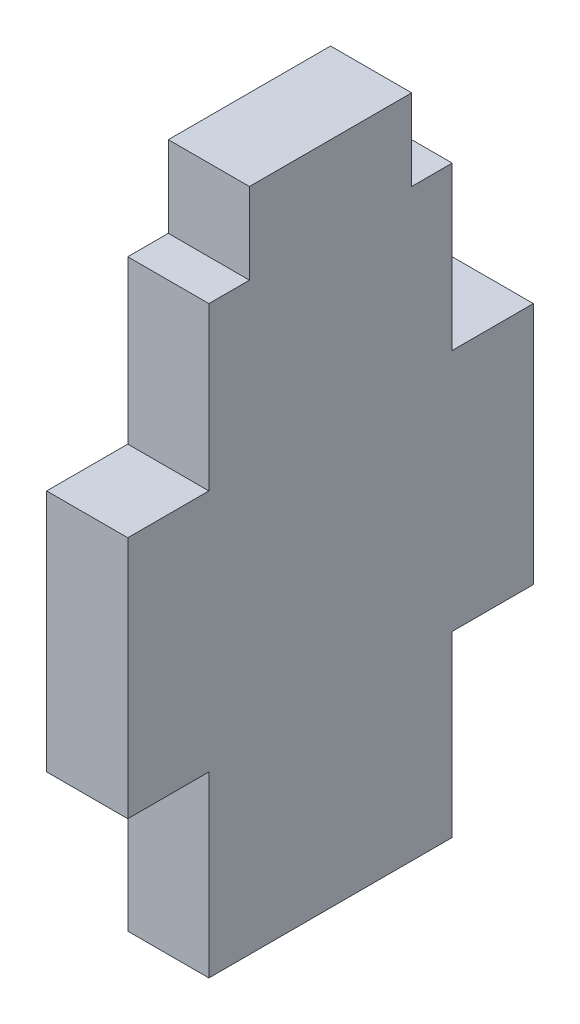
ISO-10303-21;
HEADER;
FILE_DESCRIPTION(('STEP AP214'),'2;1');
FILE_NAME('part.step','',(''),(''),'','','');
FILE_SCHEMA(('AUTOMOTIVE_DESIGN { 1 0 10303 214 1 1 1 1 }'));
ENDSEC;
DATA;
#1=APPLICATION_CONTEXT('core data for automotive mechanical design processes');
#2=APPLICATION_PROTOCOL_DEFINITION('international standard','automotive_design',2000,#1);
#3=PRODUCT_CONTEXT('',#1,'mechanical');
#4=PRODUCT('Part','Part','',(#3));
#5=PRODUCT_RELATED_PRODUCT_CATEGORY('part','',(#4));
#6=PRODUCT_DEFINITION_FORMATION('','',#4);
#7=PRODUCT_DEFINITION_CONTEXT('part definition',#1,'design');
#8=PRODUCT_DEFINITION('design','',#6,#7);
#9=PRODUCT_DEFINITION_SHAPE('','',#8);
#10=(LENGTH_UNIT() NAMED_UNIT(*) SI_UNIT(.MILLI.,.METRE.));
#11=(NAMED_UNIT(*) PLANE_ANGLE_UNIT() SI_UNIT($,.RADIAN.));
#12=(NAMED_UNIT(*) SI_UNIT($,.STERADIAN.) SOLID_ANGLE_UNIT());
#13=UNCERTAINTY_MEASURE_WITH_UNIT(LENGTH_MEASURE(1.E-05),#10,'distance_accuracy_value','');
#14=(GEOMETRIC_REPRESENTATION_CONTEXT(3) GLOBAL_UNCERTAINTY_ASSIGNED_CONTEXT((#13)) GLOBAL_UNIT_ASSIGNED_CONTEXT((#10,
#11,#12)) REPRESENTATION_CONTEXT('',''));
#15=CARTESIAN_POINT('',(0.,0.,0.));
#16=DIRECTION('',(0.,0.,1.));
#17=DIRECTION('',(1.,0.,0.));
#18=AXIS2_PLACEMENT_3D('',#15,#16,#17);
#19=CARTESIAN_POINT('',(5.,0.,0.));
#20=DIRECTION('',(0.,0.,1.));
#21=DIRECTION('',(0.,-1.,0.));
#22=AXIS2_PLACEMENT_3D('',#19,#20,#21);
#23=PLANE('',#22);
#24=DIRECTION('',(0.,1.,0.));
#25=VECTOR('',#24,1.);
#26=CARTESIAN_POINT('',(0.,0.,0.));
#27=LINE('',#26,#25);
#28=CARTESIAN_POINT('',(0.,0.,0.));
#29=VERTEX_POINT('',#28);
#30=CARTESIAN_POINT('',(0.,11.,0.));
#31=VERTEX_POINT('',#30);
#32=EDGE_CURVE('E178',#29,#31,#27,.T.);
#33=ORIENTED_EDGE('',*,*,#32,.T.);
#34=DIRECTION('',(-1.,0.,0.));
#35=VECTOR('',#34,1.);
#36=CARTESIAN_POINT('',(5.,11.,0.));
#37=LINE('',#36,#35);
#38=CARTESIAN_POINT('',(5.,11.,0.));
#39=VERTEX_POINT('',#38);
#40=EDGE_CURVE('E11',#39,#31,#37,.T.);
#41=ORIENTED_EDGE('',*,*,#40,.F.);
#42=DIRECTION('',(0.,1.,0.));
#43=VECTOR('',#42,1.);
#44=CARTESIAN_POINT('',(5.,0.,0.));
#45=LINE('',#44,#43);
#46=CARTESIAN_POINT('',(5.,0.,0.));
#47=VERTEX_POINT('',#46);
#48=EDGE_CURVE('E208',#47,#39,#45,.T.);
#49=ORIENTED_EDGE('',*,*,#48,.F.);
#50=DIRECTION('',(-1.,0.,0.));
#51=VECTOR('',#50,1.);
#52=CARTESIAN_POINT('',(5.,0.,0.));
#53=LINE('',#52,#51);
#54=EDGE_CURVE('E174',#47,#29,#53,.T.);
#55=ORIENTED_EDGE('',*,*,#54,.T.);
#56=EDGE_LOOP('',(#33,#41,#49,#55));
#57=FACE_BOUND('',#56,.T.);
#58=ADVANCED_FACE('F34',(#57),#23,.F.);
#59=CARTESIAN_POINT('',(5.,11.,0.));
#60=DIRECTION('',(0.,1.,0.));
#61=DIRECTION('',(0.,0.,1.));
#62=AXIS2_PLACEMENT_3D('',#59,#60,#61);
#63=PLANE('',#62);
#64=DIRECTION('',(0.,0.,-1.));
#65=VECTOR('',#64,1.);
#66=CARTESIAN_POINT('',(0.,11.,0.));
#67=LINE('',#66,#65);
#68=CARTESIAN_POINT('',(0.,11.,-5.));
#69=VERTEX_POINT('',#68);
#70=EDGE_CURVE('E181',#31,#69,#67,.T.);
#71=ORIENTED_EDGE('',*,*,#70,.T.);
#72=DIRECTION('',(-1.,0.,0.));
#73=VECTOR('',#72,1.);
#74=CARTESIAN_POINT('',(5.,11.,-5.));
#75=LINE('',#74,#73);
#76=CARTESIAN_POINT('',(5.,11.,-5.));
#77=VERTEX_POINT('',#76);
#78=EDGE_CURVE('E42',#77,#69,#75,.T.);
#79=ORIENTED_EDGE('',*,*,#78,.F.);
#80=DIRECTION('',(0.,0.,-1.));
#81=VECTOR('',#80,1.);
#82=CARTESIAN_POINT('',(5.,11.,0.));
#83=LINE('',#82,#81);
#84=EDGE_CURVE('E117',#39,#77,#83,.T.);
#85=ORIENTED_EDGE('',*,*,#84,.F.);
#86=ORIENTED_EDGE('',*,*,#40,.T.);
#87=EDGE_LOOP('',(#71,#79,#85,#86));
#88=FACE_BOUND('',#87,.T.);
#89=ADVANCED_FACE('F306',(#88),#63,.F.);
#90=CARTESIAN_POINT('',(5.,26.,-5.));
#91=DIRECTION('',(0.,0.,1.));
#92=DIRECTION('',(0.,-1.,0.));
#93=AXIS2_PLACEMENT_3D('',#90,#91,#92);
#94=PLANE('',#93);
#95=DIRECTION('',(0.,1.,0.));
#96=VECTOR('',#95,1.);
#97=CARTESIAN_POINT('',(0.,26.,-5.));
#98=LINE('',#97,#96);
#99=CARTESIAN_POINT('',(0.,26.,-5.));
#100=VERTEX_POINT('',#99);
#101=EDGE_CURVE('E183',#69,#100,#98,.T.);
#102=ORIENTED_EDGE('',*,*,#101,.T.);
#103=DIRECTION('',(-1.,0.,0.));
#104=VECTOR('',#103,1.);
#105=CARTESIAN_POINT('',(5.,26.,-5.));
#106=LINE('',#105,#104);
#107=CARTESIAN_POINT('',(5.,26.,-5.));
#108=VERTEX_POINT('',#107);
#109=EDGE_CURVE('E239',#108,#100,#106,.T.);
#110=ORIENTED_EDGE('',*,*,#109,.F.);
#111=DIRECTION('',(0.,1.,0.));
#112=VECTOR('',#111,1.);
#113=CARTESIAN_POINT('',(5.,26.,-5.));
#114=LINE('',#113,#112);
#115=EDGE_CURVE('E247',#77,#108,#114,.T.);
#116=ORIENTED_EDGE('',*,*,#115,.F.);
#117=ORIENTED_EDGE('',*,*,#78,.T.);
#118=EDGE_LOOP('',(#102,#110,#116,#117));
#119=FACE_BOUND('',#118,.T.);
#120=ADVANCED_FACE('F245',(#119),#94,.F.);
#121=CARTESIAN_POINT('',(5.,26.,0.));
#122=DIRECTION('',(0.,-1.,0.));
#123=DIRECTION('',(0.,0.,-1.));
#124=AXIS2_PLACEMENT_3D('',#121,#122,#123);
#125=PLANE('',#124);
#126=DIRECTION('',(0.,0.,1.));
#127=VECTOR('',#126,1.);
#128=CARTESIAN_POINT('',(0.,26.,0.));
#129=LINE('',#128,#127);
#130=CARTESIAN_POINT('',(0.,26.,0.));
#131=VERTEX_POINT('',#130);
#132=EDGE_CURVE('E185',#100,#131,#129,.T.);
#133=ORIENTED_EDGE('',*,*,#132,.T.);
#134=DIRECTION('',(-1.,0.,0.));
#135=VECTOR('',#134,1.);
#136=CARTESIAN_POINT('',(5.,26.,0.));
#137=LINE('',#136,#135);
#138=CARTESIAN_POINT('',(5.,26.,0.));
#139=VERTEX_POINT('',#138);
#140=EDGE_CURVE('E236',#139,#131,#137,.T.);
#141=ORIENTED_EDGE('',*,*,#140,.F.);
#142=DIRECTION('',(0.,0.,1.));
#143=VECTOR('',#142,1.);
#144=CARTESIAN_POINT('',(5.,26.,0.));
#145=LINE('',#144,#143);
#146=EDGE_CURVE('E265',#108,#139,#145,.T.);
#147=ORIENTED_EDGE('',*,*,#146,.F.);
#148=ORIENTED_EDGE('',*,*,#109,.T.);
#149=EDGE_LOOP('',(#133,#141,#147,#148));
#150=FACE_BOUND('',#149,.T.);
#151=ADVANCED_FACE('F256',(#150),#125,.F.);
#152=CARTESIAN_POINT('',(5.,26.,0.));
#153=DIRECTION('',(0.,0.,1.));
#154=DIRECTION('',(0.,-1.,0.));
#155=AXIS2_PLACEMENT_3D('',#152,#153,#154);
#156=PLANE('',#155);
#157=DIRECTION('',(0.,1.,0.));
#158=VECTOR('',#157,1.);
#159=CARTESIAN_POINT('',(0.,26.,0.));
#160=LINE('',#159,#158);
#161=CARTESIAN_POINT('',(0.,36.,0.));
#162=VERTEX_POINT('',#161);
#163=EDGE_CURVE('E187',#131,#162,#160,.T.);
#164=ORIENTED_EDGE('',*,*,#163,.T.);
#165=DIRECTION('',(-1.,0.,0.));
#166=VECTOR('',#165,1.);
#167=CARTESIAN_POINT('',(5.,36.,0.));
#168=LINE('',#167,#166);
#169=CARTESIAN_POINT('',(5.,36.,0.));
#170=VERTEX_POINT('',#169);
#171=EDGE_CURVE('E233',#170,#162,#168,.T.);
#172=ORIENTED_EDGE('',*,*,#171,.F.);
#173=DIRECTION('',(0.,1.,0.));
#174=VECTOR('',#173,1.);
#175=CARTESIAN_POINT('',(5.,26.,0.));
#176=LINE('',#175,#174);
#177=EDGE_CURVE('E262',#139,#170,#176,.T.);
#178=ORIENTED_EDGE('',*,*,#177,.F.);
#179=ORIENTED_EDGE('',*,*,#140,.T.);
#180=EDGE_LOOP('',(#164,#172,#178,#179));
#181=FACE_BOUND('',#180,.T.);
#182=ADVANCED_FACE('F260',(#181),#156,.F.);
#183=CARTESIAN_POINT('',(5.,36.,0.));
#184=DIRECTION('',(0.,-1.,0.));
#185=DIRECTION('',(0.,0.,-1.));
#186=AXIS2_PLACEMENT_3D('',#183,#184,#185);
#187=PLANE('',#186);
#188=DIRECTION('',(0.,0.,1.));
#189=VECTOR('',#188,1.);
#190=CARTESIAN_POINT('',(0.,36.,0.));
#191=LINE('',#190,#189);
#192=CARTESIAN_POINT('',(0.,36.,2.5));
#193=VERTEX_POINT('',#192);
#194=EDGE_CURVE('E189',#162,#193,#191,.T.);
#195=ORIENTED_EDGE('',*,*,#194,.T.);
#196=DIRECTION('',(-1.,0.,0.));
#197=VECTOR('',#196,1.);
#198=CARTESIAN_POINT('',(5.,36.,2.5));
#199=LINE('',#198,#197);
#200=CARTESIAN_POINT('',(5.,36.,2.5));
#201=VERTEX_POINT('',#200);
#202=EDGE_CURVE('E230',#201,#193,#199,.T.);
#203=ORIENTED_EDGE('',*,*,#202,.F.);
#204=DIRECTION('',(0.,0.,1.));
#205=VECTOR('',#204,1.);
#206=CARTESIAN_POINT('',(5.,36.,0.));
#207=LINE('',#206,#205);
#208=EDGE_CURVE('E264',#170,#201,#207,.T.);
#209=ORIENTED_EDGE('',*,*,#208,.F.);
#210=ORIENTED_EDGE('',*,*,#171,.T.);
#211=EDGE_LOOP('',(#195,#203,#209,#210));
#212=FACE_BOUND('',#211,.T.);
#213=ADVANCED_FACE('F319',(#212),#187,.F.);
#214=CARTESIAN_POINT('',(5.,36.,2.5));
#215=DIRECTION('',(0.,0.,1.));
#216=DIRECTION('',(1.,0.,0.));
#217=AXIS2_PLACEMENT_3D('',#214,#215,#216);
#218=PLANE('',#217);
#219=DIRECTION('',(0.,1.,0.));
#220=VECTOR('',#219,1.);
#221=CARTESIAN_POINT('',(0.,36.,2.5));
#222=LINE('',#221,#220);
#223=CARTESIAN_POINT('',(0.,41.,2.5));
#224=VERTEX_POINT('',#223);
#225=EDGE_CURVE('E191',#193,#224,#222,.T.);
#226=ORIENTED_EDGE('',*,*,#225,.T.);
#227=DIRECTION('',(-1.,0.,0.));
#228=VECTOR('',#227,1.);
#229=CARTESIAN_POINT('',(5.,41.,2.5));
#230=LINE('',#229,#228);
#231=CARTESIAN_POINT('',(5.,41.,2.5));
#232=VERTEX_POINT('',#231);
#233=EDGE_CURVE('E227',#232,#224,#230,.T.);
#234=ORIENTED_EDGE('',*,*,#233,.F.);
#235=DIRECTION('',(0.,1.,0.));
#236=VECTOR('',#235,1.);
#237=CARTESIAN_POINT('',(5.,36.,2.5));
#238=LINE('',#237,#236);
#239=EDGE_CURVE('E267',#201,#232,#238,.T.);
#240=ORIENTED_EDGE('',*,*,#239,.F.);
#241=ORIENTED_EDGE('',*,*,#202,.T.);
#242=EDGE_LOOP('',(#226,#234,#240,#241));
#243=FACE_BOUND('',#242,.T.);
#244=ADVANCED_FACE('F322',(#243),#218,.F.);
#245=CARTESIAN_POINT('',(5.,41.,12.5));
#246=DIRECTION('',(0.,-1.,0.));
#247=DIRECTION('',(0.,0.,-1.));
#248=AXIS2_PLACEMENT_3D('',#245,#246,#247);
#249=PLANE('',#248);
#250=DIRECTION('',(0.,0.,1.));
#251=VECTOR('',#250,1.);
#252=CARTESIAN_POINT('',(0.,41.,12.5));
#253=LINE('',#252,#251);
#254=CARTESIAN_POINT('',(0.,41.,12.5));
#255=VERTEX_POINT('',#254);
#256=EDGE_CURVE('E193',#224,#255,#253,.T.);
#257=ORIENTED_EDGE('',*,*,#256,.T.);
#258=DIRECTION('',(-1.,0.,0.));
#259=VECTOR('',#258,1.);
#260=CARTESIAN_POINT('',(5.,41.,12.5));
#261=LINE('',#260,#259);
#262=CARTESIAN_POINT('',(5.,41.,12.5));
#263=VERTEX_POINT('',#262);
#264=EDGE_CURVE('E224',#263,#255,#261,.T.);
#265=ORIENTED_EDGE('',*,*,#264,.F.);
#266=DIRECTION('',(0.,0.,1.));
#267=VECTOR('',#266,1.);
#268=CARTESIAN_POINT('',(5.,41.,12.5));
#269=LINE('',#268,#267);
#270=EDGE_CURVE('E273',#232,#263,#269,.T.);
#271=ORIENTED_EDGE('',*,*,#270,.F.);
#272=ORIENTED_EDGE('',*,*,#233,.T.);
#273=EDGE_LOOP('',(#257,#265,#271,#272));
#274=FACE_BOUND('',#273,.T.);
#275=ADVANCED_FACE('F326',(#274),#249,.F.);
#276=CARTESIAN_POINT('',(5.,36.,12.5));
#277=DIRECTION('',(0.,0.,-1.));
#278=DIRECTION('',(-1.,0.,0.));
#279=AXIS2_PLACEMENT_3D('',#276,#277,#278);
#280=PLANE('',#279);
#281=DIRECTION('',(0.,-1.,0.));
#282=VECTOR('',#281,1.);
#283=CARTESIAN_POINT('',(0.,36.,12.5));
#284=LINE('',#283,#282);
#285=CARTESIAN_POINT('',(0.,36.,12.5));
#286=VERTEX_POINT('',#285);
#287=EDGE_CURVE('E195',#255,#286,#284,.T.);
#288=ORIENTED_EDGE('',*,*,#287,.T.);
#289=DIRECTION('',(-1.,0.,0.));
#290=VECTOR('',#289,1.);
#291=CARTESIAN_POINT('',(5.,36.,12.5));
#292=LINE('',#291,#290);
#293=CARTESIAN_POINT('',(5.,36.,12.5));
#294=VERTEX_POINT('',#293);
#295=EDGE_CURVE('E221',#294,#286,#292,.T.);
#296=ORIENTED_EDGE('',*,*,#295,.F.);
#297=DIRECTION('',(0.,-1.,0.));
#298=VECTOR('',#297,1.);
#299=CARTESIAN_POINT('',(5.,36.,12.5));
#300=LINE('',#299,#298);
#301=EDGE_CURVE('E275',#263,#294,#300,.T.);
#302=ORIENTED_EDGE('',*,*,#301,.F.);
#303=ORIENTED_EDGE('',*,*,#264,.T.);
#304=EDGE_LOOP('',(#288,#296,#302,#303));
#305=FACE_BOUND('',#304,.T.);
#306=ADVANCED_FACE('F330',(#305),#280,.F.);
#307=CARTESIAN_POINT('',(5.,36.,12.5));
#308=DIRECTION('',(0.,-1.,0.));
#309=DIRECTION('',(0.,0.,-1.));
#310=AXIS2_PLACEMENT_3D('',#307,#308,#309);
#311=PLANE('',#310);
#312=DIRECTION('',(0.,0.,1.));
#313=VECTOR('',#312,1.);
#314=CARTESIAN_POINT('',(0.,36.,12.5));
#315=LINE('',#314,#313);
#316=CARTESIAN_POINT('',(0.,36.,15.));
#317=VERTEX_POINT('',#316);
#318=EDGE_CURVE('E197',#286,#317,#315,.T.);
#319=ORIENTED_EDGE('',*,*,#318,.T.);
#320=DIRECTION('',(-1.,0.,0.));
#321=VECTOR('',#320,1.);
#322=CARTESIAN_POINT('',(5.,36.,15.));
#323=LINE('',#322,#321);
#324=CARTESIAN_POINT('',(5.,36.,15.));
#325=VERTEX_POINT('',#324);
#326=EDGE_CURVE('E218',#325,#317,#323,.T.);
#327=ORIENTED_EDGE('',*,*,#326,.F.);
#328=DIRECTION('',(0.,0.,1.));
#329=VECTOR('',#328,1.);
#330=CARTESIAN_POINT('',(5.,36.,12.5));
#331=LINE('',#330,#329);
#332=EDGE_CURVE('E277',#294,#325,#331,.T.);
#333=ORIENTED_EDGE('',*,*,#332,.F.);
#334=ORIENTED_EDGE('',*,*,#295,.T.);
#335=EDGE_LOOP('',(#319,#327,#333,#334));
#336=FACE_BOUND('',#335,.T.);
#337=ADVANCED_FACE('F334',(#336),#311,.F.);
#338=CARTESIAN_POINT('',(5.,26.,15.));
#339=DIRECTION('',(0.,0.,-1.));
#340=DIRECTION('',(-1.,0.,0.));
#341=AXIS2_PLACEMENT_3D('',#338,#339,#340);
#342=PLANE('',#341);
#343=DIRECTION('',(0.,-1.,0.));
#344=VECTOR('',#343,1.);
#345=CARTESIAN_POINT('',(0.,26.,15.));
#346=LINE('',#345,#344);
#347=CARTESIAN_POINT('',(0.,26.,15.));
#348=VERTEX_POINT('',#347);
#349=EDGE_CURVE('E199',#317,#348,#346,.T.);
#350=ORIENTED_EDGE('',*,*,#349,.T.);
#351=DIRECTION('',(-1.,0.,0.));
#352=VECTOR('',#351,1.);
#353=CARTESIAN_POINT('',(5.,26.,15.));
#354=LINE('',#353,#352);
#355=CARTESIAN_POINT('',(5.,26.,15.));
#356=VERTEX_POINT('',#355);
#357=EDGE_CURVE('E215',#356,#348,#354,.T.);
#358=ORIENTED_EDGE('',*,*,#357,.F.);
#359=DIRECTION('',(0.,-1.,0.));
#360=VECTOR('',#359,1.);
#361=CARTESIAN_POINT('',(5.,26.,15.));
#362=LINE('',#361,#360);
#363=EDGE_CURVE('E279',#325,#356,#362,.T.);
#364=ORIENTED_EDGE('',*,*,#363,.F.);
#365=ORIENTED_EDGE('',*,*,#326,.T.);
#366=EDGE_LOOP('',(#350,#358,#364,#365));
#367=FACE_BOUND('',#366,.T.);
#368=ADVANCED_FACE('F338',(#367),#342,.F.);
#369=CARTESIAN_POINT('',(5.,26.,15.));
#370=DIRECTION('',(0.,-1.,0.));
#371=DIRECTION('',(0.,0.,-1.));
#372=AXIS2_PLACEMENT_3D('',#369,#370,#371);
#373=PLANE('',#372);
#374=DIRECTION('',(0.,0.,1.));
#375=VECTOR('',#374,1.);
#376=CARTESIAN_POINT('',(0.,26.,15.));
#377=LINE('',#376,#375);
#378=CARTESIAN_POINT('',(0.,26.,20.));
#379=VERTEX_POINT('',#378);
#380=EDGE_CURVE('E201',#348,#379,#377,.T.);
#381=ORIENTED_EDGE('',*,*,#380,.T.);
#382=DIRECTION('',(-1.,0.,0.));
#383=VECTOR('',#382,1.);
#384=CARTESIAN_POINT('',(5.,26.,20.));
#385=LINE('',#384,#383);
#386=CARTESIAN_POINT('',(5.,26.,20.));
#387=VERTEX_POINT('',#386);
#388=EDGE_CURVE('E212',#387,#379,#385,.T.);
#389=ORIENTED_EDGE('',*,*,#388,.F.);
#390=DIRECTION('',(0.,0.,1.));
#391=VECTOR('',#390,1.);
#392=CARTESIAN_POINT('',(5.,26.,15.));
#393=LINE('',#392,#391);
#394=EDGE_CURVE('E281',#356,#387,#393,.T.);
#395=ORIENTED_EDGE('',*,*,#394,.F.);
#396=ORIENTED_EDGE('',*,*,#357,.T.);
#397=EDGE_LOOP('',(#381,#389,#395,#396));
#398=FACE_BOUND('',#397,.T.);
#399=ADVANCED_FACE('F287',(#398),#373,.F.);
#400=CARTESIAN_POINT('',(5.,26.,20.));
#401=DIRECTION('',(0.,0.,-1.));
#402=DIRECTION('',(-1.,0.,0.));
#403=AXIS2_PLACEMENT_3D('',#400,#401,#402);
#404=PLANE('',#403);
#405=DIRECTION('',(0.,-1.,0.));
#406=VECTOR('',#405,1.);
#407=CARTESIAN_POINT('',(0.,26.,20.));
#408=LINE('',#407,#406);
#409=CARTESIAN_POINT('',(0.,11.,20.));
#410=VERTEX_POINT('',#409);
#411=EDGE_CURVE('E203',#379,#410,#408,.T.);
#412=ORIENTED_EDGE('',*,*,#411,.T.);
#413=DIRECTION('',(-1.,0.,0.));
#414=VECTOR('',#413,1.);
#415=CARTESIAN_POINT('',(5.,11.,20.));
#416=LINE('',#415,#414);
#417=CARTESIAN_POINT('',(5.,11.,20.));
#418=VERTEX_POINT('',#417);
#419=EDGE_CURVE('E169',#418,#410,#416,.T.);
#420=ORIENTED_EDGE('',*,*,#419,.F.);
#421=DIRECTION('',(0.,-1.,0.));
#422=VECTOR('',#421,1.);
#423=CARTESIAN_POINT('',(5.,26.,20.));
#424=LINE('',#423,#422);
#425=EDGE_CURVE('E160',#387,#418,#424,.T.);
#426=ORIENTED_EDGE('',*,*,#425,.F.);
#427=ORIENTED_EDGE('',*,*,#388,.T.);
#428=EDGE_LOOP('',(#412,#420,#426,#427));
#429=FACE_BOUND('',#428,.T.);
#430=ADVANCED_FACE('F291',(#429),#404,.F.);
#431=CARTESIAN_POINT('',(5.,11.,15.));
#432=DIRECTION('',(0.,1.,0.));
#433=DIRECTION('',(0.,0.,1.));
#434=AXIS2_PLACEMENT_3D('',#431,#432,#433);
#435=PLANE('',#434);
#436=DIRECTION('',(0.,0.,-1.));
#437=VECTOR('',#436,1.);
#438=CARTESIAN_POINT('',(0.,11.,15.));
#439=LINE('',#438,#437);
#440=CARTESIAN_POINT('',(0.,11.,15.));
#441=VERTEX_POINT('',#440);
#442=EDGE_CURVE('E168',#410,#441,#439,.T.);
#443=ORIENTED_EDGE('',*,*,#442,.T.);
#444=DIRECTION('',(-1.,0.,0.));
#445=VECTOR('',#444,1.);
#446=CARTESIAN_POINT('',(5.,11.,15.));
#447=LINE('',#446,#445);
#448=CARTESIAN_POINT('',(5.,11.,15.));
#449=VERTEX_POINT('',#448);
#450=EDGE_CURVE('E165',#449,#441,#447,.T.);
#451=ORIENTED_EDGE('',*,*,#450,.F.);
#452=DIRECTION('',(0.,0.,-1.));
#453=VECTOR('',#452,1.);
#454=CARTESIAN_POINT('',(5.,11.,15.));
#455=LINE('',#454,#453);
#456=EDGE_CURVE('E154',#418,#449,#455,.T.);
#457=ORIENTED_EDGE('',*,*,#456,.F.);
#458=ORIENTED_EDGE('',*,*,#419,.T.);
#459=EDGE_LOOP('',(#443,#451,#457,#458));
#460=FACE_BOUND('',#459,.T.);
#461=ADVANCED_FACE('F166',(#460),#435,.F.);
#462=CARTESIAN_POINT('',(5.,0.,15.));
#463=DIRECTION('',(0.,0.,-1.));
#464=DIRECTION('',(0.,1.,0.));
#465=AXIS2_PLACEMENT_3D('',#462,#463,#464);
#466=PLANE('',#465);
#467=DIRECTION('',(0.,-1.,0.));
#468=VECTOR('',#467,1.);
#469=CARTESIAN_POINT('',(0.,0.,15.));
#470=LINE('',#469,#468);
#471=CARTESIAN_POINT('',(0.,0.,15.));
#472=VERTEX_POINT('',#471);
#473=EDGE_CURVE('E103',#441,#472,#470,.T.);
#474=ORIENTED_EDGE('',*,*,#473,.T.);
#475=DIRECTION('',(-1.,0.,0.));
#476=VECTOR('',#475,1.);
#477=CARTESIAN_POINT('',(5.,0.,15.));
#478=LINE('',#477,#476);
#479=CARTESIAN_POINT('',(5.,0.,15.));
#480=VERTEX_POINT('',#479);
#481=EDGE_CURVE('E170',#480,#472,#478,.T.);
#482=ORIENTED_EDGE('',*,*,#481,.F.);
#483=DIRECTION('',(0.,-1.,0.));
#484=VECTOR('',#483,1.);
#485=CARTESIAN_POINT('',(5.,0.,15.));
#486=LINE('',#485,#484);
#487=EDGE_CURVE('E158',#449,#480,#486,.T.);
#488=ORIENTED_EDGE('',*,*,#487,.F.);
#489=ORIENTED_EDGE('',*,*,#450,.T.);
#490=EDGE_LOOP('',(#474,#482,#488,#489));
#491=FACE_BOUND('',#490,.T.);
#492=ADVANCED_FACE('F172',(#491),#466,.F.);
#493=CARTESIAN_POINT('',(5.,0.,0.));
#494=DIRECTION('',(0.,1.,0.));
#495=DIRECTION('',(0.,0.,1.));
#496=AXIS2_PLACEMENT_3D('',#493,#494,#495);
#497=PLANE('',#496);
#498=DIRECTION('',(0.,0.,-1.));
#499=VECTOR('',#498,1.);
#500=CARTESIAN_POINT('',(0.,0.,0.));
#501=LINE('',#500,#499);
#502=EDGE_CURVE('E109',#472,#29,#501,.T.);
#503=ORIENTED_EDGE('',*,*,#502,.T.);
#504=ORIENTED_EDGE('',*,*,#54,.F.);
#505=DIRECTION('',(0.,0.,-1.));
#506=VECTOR('',#505,1.);
#507=CARTESIAN_POINT('',(5.,0.,0.));
#508=LINE('',#507,#506);
#509=EDGE_CURVE('E50',#480,#47,#508,.T.);
#510=ORIENTED_EDGE('',*,*,#509,.F.);
#511=ORIENTED_EDGE('',*,*,#481,.T.);
#512=EDGE_LOOP('',(#503,#504,#510,#511));
#513=FACE_BOUND('',#512,.T.);
#514=ADVANCED_FACE('F295',(#513),#497,.F.);
#515=CARTESIAN_POINT('',(5.,0.,0.));
#516=DIRECTION('',(-1.,0.,0.));
#517=DIRECTION('',(0.,0.,1.));
#518=AXIS2_PLACEMENT_3D('',#515,#516,#517);
#519=PLANE('',#518);
#520=ORIENTED_EDGE('',*,*,#48,.T.);
#521=ORIENTED_EDGE('',*,*,#84,.T.);
#522=ORIENTED_EDGE('',*,*,#115,.T.);
#523=ORIENTED_EDGE('',*,*,#146,.T.);
#524=ORIENTED_EDGE('',*,*,#177,.T.);
#525=ORIENTED_EDGE('',*,*,#208,.T.);
#526=ORIENTED_EDGE('',*,*,#239,.T.);
#527=ORIENTED_EDGE('',*,*,#270,.T.);
#528=ORIENTED_EDGE('',*,*,#301,.T.);
#529=ORIENTED_EDGE('',*,*,#332,.T.);
#530=ORIENTED_EDGE('',*,*,#363,.T.);
#531=ORIENTED_EDGE('',*,*,#394,.T.);
#532=ORIENTED_EDGE('',*,*,#425,.T.);
#533=ORIENTED_EDGE('',*,*,#456,.T.);
#534=ORIENTED_EDGE('',*,*,#487,.T.);
#535=ORIENTED_EDGE('',*,*,#509,.T.);
#536=EDGE_LOOP('',(#520,#521,#522,#523,#524,#525,#526,#527,#528,#529,#530,#531,#532,#533,#534,#535));
#537=FACE_BOUND('',#536,.T.);
#538=ADVANCED_FACE('F156',(#537),#519,.F.);
#539=CARTESIAN_POINT('',(0.,0.,0.));
#540=DIRECTION('',(-1.,0.,0.));
#541=DIRECTION('',(0.,0.,1.));
#542=AXIS2_PLACEMENT_3D('',#539,#540,#541);
#543=PLANE('',#542);
#544=ORIENTED_EDGE('',*,*,#32,.F.);
#545=ORIENTED_EDGE('',*,*,#502,.F.);
#546=ORIENTED_EDGE('',*,*,#473,.F.);
#547=ORIENTED_EDGE('',*,*,#442,.F.);
#548=ORIENTED_EDGE('',*,*,#411,.F.);
#549=ORIENTED_EDGE('',*,*,#380,.F.);
#550=ORIENTED_EDGE('',*,*,#349,.F.);
#551=ORIENTED_EDGE('',*,*,#318,.F.);
#552=ORIENTED_EDGE('',*,*,#287,.F.);
#553=ORIENTED_EDGE('',*,*,#256,.F.);
#554=ORIENTED_EDGE('',*,*,#225,.F.);
#555=ORIENTED_EDGE('',*,*,#194,.F.);
#556=ORIENTED_EDGE('',*,*,#163,.F.);
#557=ORIENTED_EDGE('',*,*,#132,.F.);
#558=ORIENTED_EDGE('',*,*,#101,.F.);
#559=ORIENTED_EDGE('',*,*,#70,.F.);
#560=EDGE_LOOP('',(#544,#545,#546,#547,#548,#549,#550,#551,#552,#553,#554,#555,#556,#557,#558,#559));
#561=FACE_BOUND('',#560,.T.);
#562=ADVANCED_FACE('F251',(#561),#543,.T.);
#563=CLOSED_SHELL('',(#58,#89,#120,#151,#182,#213,#244,#275,#306,#337,#368,#399,#430,#461,#492,
#514,#538,#562));
#564=MANIFOLD_SOLID_BREP('B2',#563);
#565=ADVANCED_BREP_SHAPE_REPRESENTATION('',(#18,#564),#14);
#566=SHAPE_DEFINITION_REPRESENTATION(#9,#565);
ENDSEC;
END-ISO-10303-21;
